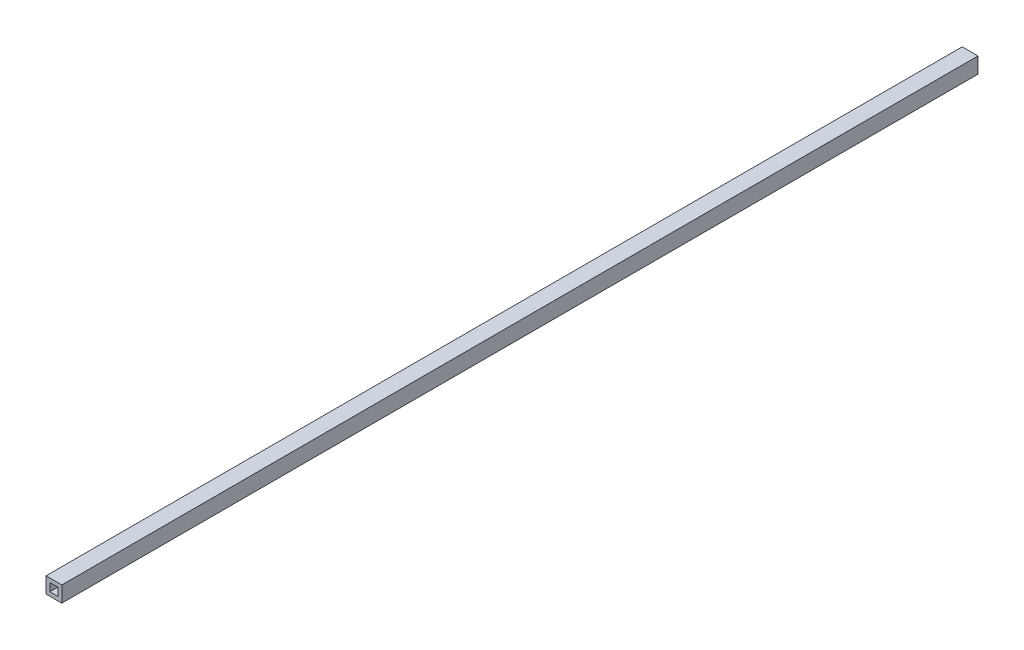
ISO-10303-21;
HEADER;
FILE_DESCRIPTION(('STEP AP214'),'2;1');
FILE_NAME('part.step','',(''),(''),'','','');
FILE_SCHEMA(('AUTOMOTIVE_DESIGN { 1 0 10303 214 1 1 1 1 }'));
ENDSEC;
DATA;
#1=APPLICATION_CONTEXT('core data for automotive mechanical design processes');
#2=APPLICATION_PROTOCOL_DEFINITION('international standard','automotive_design',2000,#1);
#3=PRODUCT_CONTEXT('',#1,'mechanical');
#4=PRODUCT('Part','Part','',(#3));
#5=PRODUCT_RELATED_PRODUCT_CATEGORY('part','',(#4));
#6=PRODUCT_DEFINITION_FORMATION('','',#4);
#7=PRODUCT_DEFINITION_CONTEXT('part definition',#1,'design');
#8=PRODUCT_DEFINITION('design','',#6,#7);
#9=PRODUCT_DEFINITION_SHAPE('','',#8);
#10=(LENGTH_UNIT() NAMED_UNIT(*) SI_UNIT(.MILLI.,.METRE.));
#11=(NAMED_UNIT(*) PLANE_ANGLE_UNIT() SI_UNIT($,.RADIAN.));
#12=(NAMED_UNIT(*) SI_UNIT($,.STERADIAN.) SOLID_ANGLE_UNIT());
#13=UNCERTAINTY_MEASURE_WITH_UNIT(LENGTH_MEASURE(1.E-05),#10,'distance_accuracy_value','');
#14=(GEOMETRIC_REPRESENTATION_CONTEXT(3) GLOBAL_UNCERTAINTY_ASSIGNED_CONTEXT((#13)) GLOBAL_UNIT_ASSIGNED_CONTEXT((#10,
#11,#12)) REPRESENTATION_CONTEXT('',''));
#15=CARTESIAN_POINT('',(0.,0.,0.));
#16=DIRECTION('',(0.,0.,1.));
#17=DIRECTION('',(1.,0.,0.));
#18=AXIS2_PLACEMENT_3D('',#15,#16,#17);
#19=CARTESIAN_POINT('',(0.,0.,1160.));
#20=DIRECTION('',(0.,0.,1.));
#21=DIRECTION('',(1.,0.,0.));
#22=AXIS2_PLACEMENT_3D('',#19,#20,#21);
#23=PLANE('',#22);
#24=DIRECTION('',(0.,1.,0.));
#25=VECTOR('',#24,1.);
#26=CARTESIAN_POINT('',(10.,-10.,1160.));
#27=LINE('',#26,#25);
#28=CARTESIAN_POINT('',(10.,-10.,1160.));
#29=VERTEX_POINT('',#28);
#30=CARTESIAN_POINT('',(10.,10.,1160.));
#31=VERTEX_POINT('',#30);
#32=EDGE_CURVE('E158',#29,#31,#27,.T.);
#33=ORIENTED_EDGE('',*,*,#32,.T.);
#34=DIRECTION('',(-1.,0.,0.));
#35=VECTOR('',#34,1.);
#36=CARTESIAN_POINT('',(-10.,10.,1160.));
#37=LINE('',#36,#35);
#38=CARTESIAN_POINT('',(-10.,10.,1160.));
#39=VERTEX_POINT('',#38);
#40=EDGE_CURVE('E161',#31,#39,#37,.T.);
#41=ORIENTED_EDGE('',*,*,#40,.T.);
#42=DIRECTION('',(0.,-1.,0.));
#43=VECTOR('',#42,1.);
#44=CARTESIAN_POINT('',(-10.,-10.,1160.));
#45=LINE('',#44,#43);
#46=CARTESIAN_POINT('',(-10.,-10.,1160.));
#47=VERTEX_POINT('',#46);
#48=EDGE_CURVE('E164',#39,#47,#45,.T.);
#49=ORIENTED_EDGE('',*,*,#48,.T.);
#50=DIRECTION('',(1.,0.,0.));
#51=VECTOR('',#50,1.);
#52=CARTESIAN_POINT('',(-10.,-10.,1160.));
#53=LINE('',#52,#51);
#54=EDGE_CURVE('E166',#47,#29,#53,.T.);
#55=ORIENTED_EDGE('',*,*,#54,.T.);
#56=EDGE_LOOP('',(#33,#41,#49,#55));
#57=FACE_BOUND('',#56,.T.);
#58=DIRECTION('',(-1.,0.,0.));
#59=VECTOR('',#58,1.);
#60=CARTESIAN_POINT('',(0.,5.,1160.));
#61=LINE('',#60,#59);
#62=CARTESIAN_POINT('',(5.,5.,1160.));
#63=VERTEX_POINT('',#62);
#64=CARTESIAN_POINT('',(-5.,5.,1160.));
#65=VERTEX_POINT('',#64);
#66=EDGE_CURVE('E130',#63,#65,#61,.T.);
#67=ORIENTED_EDGE('',*,*,#66,.F.);
#68=DIRECTION('',(0.,1.,0.));
#69=VECTOR('',#68,1.);
#70=CARTESIAN_POINT('',(5.,0.,1160.));
#71=LINE('',#70,#69);
#72=CARTESIAN_POINT('',(5.,-5.,1160.));
#73=VERTEX_POINT('',#72);
#74=EDGE_CURVE('E122',#73,#63,#71,.T.);
#75=ORIENTED_EDGE('',*,*,#74,.F.);
#76=DIRECTION('',(1.,0.,0.));
#77=VECTOR('',#76,1.);
#78=CARTESIAN_POINT('',(0.,-5.,1160.));
#79=LINE('',#78,#77);
#80=CARTESIAN_POINT('',(-5.,-5.,1160.));
#81=VERTEX_POINT('',#80);
#82=EDGE_CURVE('E144',#81,#73,#79,.T.);
#83=ORIENTED_EDGE('',*,*,#82,.F.);
#84=DIRECTION('',(0.,-1.,0.));
#85=VECTOR('',#84,1.);
#86=CARTESIAN_POINT('',(-5.,0.,1160.));
#87=LINE('',#86,#85);
#88=EDGE_CURVE('E142',#65,#81,#87,.T.);
#89=ORIENTED_EDGE('',*,*,#88,.F.);
#90=EDGE_LOOP('',(#67,#75,#83,#89));
#91=FACE_BOUND('',#90,.T.);
#92=ADVANCED_FACE('F57',(#57,#91),#23,.T.);
#93=CARTESIAN_POINT('',(0.,0.,0.));
#94=DIRECTION('',(0.,0.,1.));
#95=DIRECTION('',(1.,0.,0.));
#96=AXIS2_PLACEMENT_3D('',#93,#94,#95);
#97=PLANE('',#96);
#98=DIRECTION('',(0.,1.,0.));
#99=VECTOR('',#98,1.);
#100=CARTESIAN_POINT('',(10.,-10.,0.));
#101=LINE('',#100,#99);
#102=CARTESIAN_POINT('',(10.,-10.,0.));
#103=VERTEX_POINT('',#102);
#104=CARTESIAN_POINT('',(10.,10.,0.));
#105=VERTEX_POINT('',#104);
#106=EDGE_CURVE('E138',#103,#105,#101,.T.);
#107=ORIENTED_EDGE('',*,*,#106,.F.);
#108=DIRECTION('',(1.,0.,0.));
#109=VECTOR('',#108,1.);
#110=CARTESIAN_POINT('',(-10.,-10.,0.));
#111=LINE('',#110,#109);
#112=CARTESIAN_POINT('',(-10.,-10.,0.));
#113=VERTEX_POINT('',#112);
#114=EDGE_CURVE('E162',#113,#103,#111,.T.);
#115=ORIENTED_EDGE('',*,*,#114,.F.);
#116=DIRECTION('',(0.,-1.,0.));
#117=VECTOR('',#116,1.);
#118=CARTESIAN_POINT('',(-10.,-10.,0.));
#119=LINE('',#118,#117);
#120=CARTESIAN_POINT('',(-10.,10.,0.));
#121=VERTEX_POINT('',#120);
#122=EDGE_CURVE('E173',#121,#113,#119,.T.);
#123=ORIENTED_EDGE('',*,*,#122,.F.);
#124=DIRECTION('',(-1.,0.,0.));
#125=VECTOR('',#124,1.);
#126=CARTESIAN_POINT('',(-10.,10.,0.));
#127=LINE('',#126,#125);
#128=EDGE_CURVE('E171',#105,#121,#127,.T.);
#129=ORIENTED_EDGE('',*,*,#128,.F.);
#130=EDGE_LOOP('',(#107,#115,#123,#129));
#131=FACE_BOUND('',#130,.T.);
#132=DIRECTION('',(0.,1.,0.));
#133=VECTOR('',#132,1.);
#134=CARTESIAN_POINT('',(5.,0.,0.));
#135=LINE('',#134,#133);
#136=CARTESIAN_POINT('',(5.,-5.,0.));
#137=VERTEX_POINT('',#136);
#138=CARTESIAN_POINT('',(5.,5.,0.));
#139=VERTEX_POINT('',#138);
#140=EDGE_CURVE('E80',#137,#139,#135,.T.);
#141=ORIENTED_EDGE('',*,*,#140,.T.);
#142=DIRECTION('',(-1.,0.,0.));
#143=VECTOR('',#142,1.);
#144=CARTESIAN_POINT('',(0.,5.,0.));
#145=LINE('',#144,#143);
#146=CARTESIAN_POINT('',(-5.,5.,0.));
#147=VERTEX_POINT('',#146);
#148=EDGE_CURVE('E137',#139,#147,#145,.T.);
#149=ORIENTED_EDGE('',*,*,#148,.T.);
#150=DIRECTION('',(0.,-1.,0.));
#151=VECTOR('',#150,1.);
#152=CARTESIAN_POINT('',(-5.,0.,0.));
#153=LINE('',#152,#151);
#154=CARTESIAN_POINT('',(-5.,-5.,0.));
#155=VERTEX_POINT('',#154);
#156=EDGE_CURVE('E150',#147,#155,#153,.T.);
#157=ORIENTED_EDGE('',*,*,#156,.T.);
#158=DIRECTION('',(1.,0.,0.));
#159=VECTOR('',#158,1.);
#160=CARTESIAN_POINT('',(0.,-5.,0.));
#161=LINE('',#160,#159);
#162=EDGE_CURVE('E131',#155,#137,#161,.T.);
#163=ORIENTED_EDGE('',*,*,#162,.T.);
#164=EDGE_LOOP('',(#141,#149,#157,#163));
#165=FACE_BOUND('',#164,.T.);
#166=ADVANCED_FACE('F191',(#131,#165),#97,.F.);
#167=CARTESIAN_POINT('',(10.,-10.,1160.));
#168=DIRECTION('',(-1.,0.,0.));
#169=DIRECTION('',(0.,0.,1.));
#170=AXIS2_PLACEMENT_3D('',#167,#168,#169);
#171=PLANE('',#170);
#172=ORIENTED_EDGE('',*,*,#106,.T.);
#173=DIRECTION('',(0.,0.,-1.));
#174=VECTOR('',#173,1.);
#175=CARTESIAN_POINT('',(10.,10.,1160.));
#176=LINE('',#175,#174);
#177=EDGE_CURVE('E12',#31,#105,#176,.T.);
#178=ORIENTED_EDGE('',*,*,#177,.F.);
#179=ORIENTED_EDGE('',*,*,#32,.F.);
#180=DIRECTION('',(0.,0.,-1.));
#181=VECTOR('',#180,1.);
#182=CARTESIAN_POINT('',(10.,-10.,1160.));
#183=LINE('',#182,#181);
#184=EDGE_CURVE('E168',#29,#103,#183,.T.);
#185=ORIENTED_EDGE('',*,*,#184,.T.);
#186=EDGE_LOOP('',(#172,#178,#179,#185));
#187=FACE_BOUND('',#186,.T.);
#188=ADVANCED_FACE('F59',(#187),#171,.F.);
#189=CARTESIAN_POINT('',(-10.,10.,1160.));
#190=DIRECTION('',(0.,-1.,0.));
#191=DIRECTION('',(0.,0.,-1.));
#192=AXIS2_PLACEMENT_3D('',#189,#190,#191);
#193=PLANE('',#192);
#194=ORIENTED_EDGE('',*,*,#128,.T.);
#195=DIRECTION('',(0.,0.,-1.));
#196=VECTOR('',#195,1.);
#197=CARTESIAN_POINT('',(-10.,10.,1160.));
#198=LINE('',#197,#196);
#199=EDGE_CURVE('E65',#39,#121,#198,.T.);
#200=ORIENTED_EDGE('',*,*,#199,.F.);
#201=ORIENTED_EDGE('',*,*,#40,.F.);
#202=ORIENTED_EDGE('',*,*,#177,.T.);
#203=EDGE_LOOP('',(#194,#200,#201,#202));
#204=FACE_BOUND('',#203,.T.);
#205=ADVANCED_FACE('F201',(#204),#193,.F.);
#206=CARTESIAN_POINT('',(-10.,-10.,1160.));
#207=DIRECTION('',(1.,0.,0.));
#208=DIRECTION('',(0.,0.,-1.));
#209=AXIS2_PLACEMENT_3D('',#206,#207,#208);
#210=PLANE('',#209);
#211=ORIENTED_EDGE('',*,*,#122,.T.);
#212=DIRECTION('',(0.,0.,-1.));
#213=VECTOR('',#212,1.);
#214=CARTESIAN_POINT('',(-10.,-10.,1160.));
#215=LINE('',#214,#213);
#216=EDGE_CURVE('E178',#47,#113,#215,.T.);
#217=ORIENTED_EDGE('',*,*,#216,.F.);
#218=ORIENTED_EDGE('',*,*,#48,.F.);
#219=ORIENTED_EDGE('',*,*,#199,.T.);
#220=EDGE_LOOP('',(#211,#217,#218,#219));
#221=FACE_BOUND('',#220,.T.);
#222=ADVANCED_FACE('F185',(#221),#210,.F.);
#223=CARTESIAN_POINT('',(-10.,-10.,1160.));
#224=DIRECTION('',(0.,1.,0.));
#225=DIRECTION('',(0.,0.,1.));
#226=AXIS2_PLACEMENT_3D('',#223,#224,#225);
#227=PLANE('',#226);
#228=ORIENTED_EDGE('',*,*,#114,.T.);
#229=ORIENTED_EDGE('',*,*,#184,.F.);
#230=ORIENTED_EDGE('',*,*,#54,.F.);
#231=ORIENTED_EDGE('',*,*,#216,.T.);
#232=EDGE_LOOP('',(#228,#229,#230,#231));
#233=FACE_BOUND('',#232,.T.);
#234=ADVANCED_FACE('F195',(#233),#227,.F.);
#235=CARTESIAN_POINT('',(5.,0.,1160.));
#236=DIRECTION('',(-1.,0.,0.));
#237=DIRECTION('',(0.,0.,1.));
#238=AXIS2_PLACEMENT_3D('',#235,#236,#237);
#239=PLANE('',#238);
#240=ORIENTED_EDGE('',*,*,#140,.F.);
#241=DIRECTION('',(0.,0.,-1.));
#242=VECTOR('',#241,1.);
#243=CARTESIAN_POINT('',(5.,-5.,1160.));
#244=LINE('',#243,#242);
#245=EDGE_CURVE('E126',#73,#137,#244,.T.);
#246=ORIENTED_EDGE('',*,*,#245,.F.);
#247=ORIENTED_EDGE('',*,*,#74,.T.);
#248=DIRECTION('',(0.,0.,-1.));
#249=VECTOR('',#248,1.);
#250=CARTESIAN_POINT('',(5.,5.,1160.));
#251=LINE('',#250,#249);
#252=EDGE_CURVE('E125',#63,#139,#251,.T.);
#253=ORIENTED_EDGE('',*,*,#252,.T.);
#254=EDGE_LOOP('',(#240,#246,#247,#253));
#255=FACE_BOUND('',#254,.T.);
#256=ADVANCED_FACE('F124',(#255),#239,.T.);
#257=CARTESIAN_POINT('',(0.,5.,1160.));
#258=DIRECTION('',(0.,-1.,0.));
#259=DIRECTION('',(0.,0.,-1.));
#260=AXIS2_PLACEMENT_3D('',#257,#258,#259);
#261=PLANE('',#260);
#262=ORIENTED_EDGE('',*,*,#148,.F.);
#263=ORIENTED_EDGE('',*,*,#252,.F.);
#264=ORIENTED_EDGE('',*,*,#66,.T.);
#265=DIRECTION('',(0.,0.,-1.));
#266=VECTOR('',#265,1.);
#267=CARTESIAN_POINT('',(-5.,5.,1160.));
#268=LINE('',#267,#266);
#269=EDGE_CURVE('E139',#65,#147,#268,.T.);
#270=ORIENTED_EDGE('',*,*,#269,.T.);
#271=EDGE_LOOP('',(#262,#263,#264,#270));
#272=FACE_BOUND('',#271,.T.);
#273=ADVANCED_FACE('F134',(#272),#261,.T.);
#274=CARTESIAN_POINT('',(-5.,0.,1160.));
#275=DIRECTION('',(1.,0.,0.));
#276=DIRECTION('',(0.,0.,-1.));
#277=AXIS2_PLACEMENT_3D('',#274,#275,#276);
#278=PLANE('',#277);
#279=ORIENTED_EDGE('',*,*,#156,.F.);
#280=ORIENTED_EDGE('',*,*,#269,.F.);
#281=ORIENTED_EDGE('',*,*,#88,.T.);
#282=DIRECTION('',(0.,0.,-1.));
#283=VECTOR('',#282,1.);
#284=CARTESIAN_POINT('',(-5.,-5.,1160.));
#285=LINE('',#284,#283);
#286=EDGE_CURVE('E72',#81,#155,#285,.T.);
#287=ORIENTED_EDGE('',*,*,#286,.T.);
#288=EDGE_LOOP('',(#279,#280,#281,#287));
#289=FACE_BOUND('',#288,.T.);
#290=ADVANCED_FACE('F224',(#289),#278,.T.);
#291=CARTESIAN_POINT('',(0.,-5.,1160.));
#292=DIRECTION('',(0.,1.,0.));
#293=DIRECTION('',(0.,0.,1.));
#294=AXIS2_PLACEMENT_3D('',#291,#292,#293);
#295=PLANE('',#294);
#296=ORIENTED_EDGE('',*,*,#162,.F.);
#297=ORIENTED_EDGE('',*,*,#286,.F.);
#298=ORIENTED_EDGE('',*,*,#82,.T.);
#299=ORIENTED_EDGE('',*,*,#245,.T.);
#300=EDGE_LOOP('',(#296,#297,#298,#299));
#301=FACE_BOUND('',#300,.T.);
#302=ADVANCED_FACE('F228',(#301),#295,.T.);
#303=CLOSED_SHELL('',(#92,#166,#188,#205,#222,#234,#256,#273,#290,#302));
#304=MANIFOLD_SOLID_BREP('B2',#303);
#305=ADVANCED_BREP_SHAPE_REPRESENTATION('',(#18,#304),#14);
#306=SHAPE_DEFINITION_REPRESENTATION(#9,#305);
ENDSEC;
END-ISO-10303-21;
